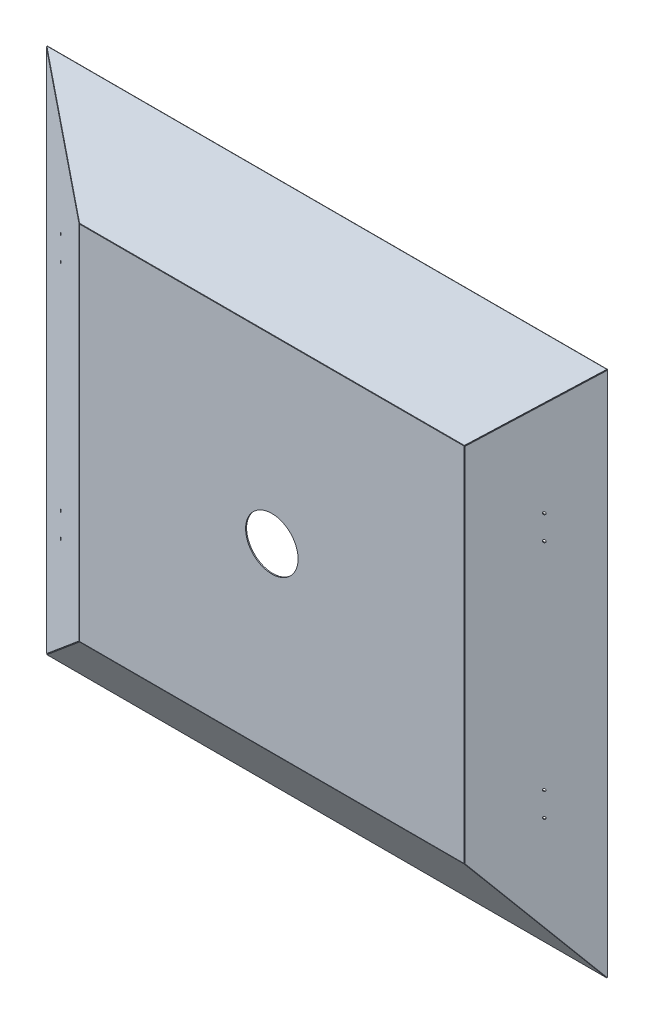
ISO-10303-21;
HEADER;
FILE_DESCRIPTION(('STEP AP214'),'2;1');
FILE_NAME('part.step','',(''),(''),'','','');
FILE_SCHEMA(('AUTOMOTIVE_DESIGN { 1 0 10303 214 1 1 1 1 }'));
ENDSEC;
DATA;
#1=APPLICATION_CONTEXT('core data for automotive mechanical design processes');
#2=APPLICATION_PROTOCOL_DEFINITION('international standard','automotive_design',2000,#1);
#3=PRODUCT_CONTEXT('',#1,'mechanical');
#4=PRODUCT('Part','Part','',(#3));
#5=PRODUCT_RELATED_PRODUCT_CATEGORY('part','',(#4));
#6=PRODUCT_DEFINITION_FORMATION('','',#4);
#7=PRODUCT_DEFINITION_CONTEXT('part definition',#1,'design');
#8=PRODUCT_DEFINITION('design','',#6,#7);
#9=PRODUCT_DEFINITION_SHAPE('','',#8);
#10=(LENGTH_UNIT() NAMED_UNIT(*) SI_UNIT(.MILLI.,.METRE.));
#11=(NAMED_UNIT(*) PLANE_ANGLE_UNIT() SI_UNIT($,.RADIAN.));
#12=(NAMED_UNIT(*) SI_UNIT($,.STERADIAN.) SOLID_ANGLE_UNIT());
#13=UNCERTAINTY_MEASURE_WITH_UNIT(LENGTH_MEASURE(1.E-05),#10,'distance_accuracy_value','');
#14=(GEOMETRIC_REPRESENTATION_CONTEXT(3) GLOBAL_UNCERTAINTY_ASSIGNED_CONTEXT((#13)) GLOBAL_UNIT_ASSIGNED_CONTEXT((#10,
#11,#12)) REPRESENTATION_CONTEXT('',''));
#15=CARTESIAN_POINT('',(0.,0.,0.));
#16=DIRECTION('',(0.,0.,1.));
#17=DIRECTION('',(1.,0.,0.));
#18=AXIS2_PLACEMENT_3D('',#15,#16,#17);
#19=CARTESIAN_POINT('',(-564.294117647059,-530.000000000001,103.));
#20=DIRECTION('',(1.,0.,0.));
#21=DIRECTION('',(0.,0.,-1.));
#22=AXIS2_PLACEMENT_3D('',#19,#20,#21);
#23=PLANE('',#22);
#24=DIRECTION('',(0.,-1.,0.));
#25=VECTOR('',#24,1.);
#26=CARTESIAN_POINT('',(-564.294117647059,-530.000000000001,100.));
#27=LINE('',#26,#25);
#28=CARTESIAN_POINT('',(-564.294117647059,530.000000000001,100.));
#29=VERTEX_POINT('',#28);
#30=CARTESIAN_POINT('',(-564.294117647059,-530.000000000001,100.));
#31=VERTEX_POINT('',#30);
#32=EDGE_CURVE('E120',#29,#31,#27,.T.);
#33=ORIENTED_EDGE('',*,*,#32,.T.);
#34=DIRECTION('',(0.,0.,-1.));
#35=VECTOR('',#34,1.);
#36=CARTESIAN_POINT('',(-564.294117647059,-530.000000000001,103.));
#37=LINE('',#36,#35);
#38=CARTESIAN_POINT('',(-564.294117647059,-530.000000000001,103.));
#39=VERTEX_POINT('',#38);
#40=EDGE_CURVE('E12',#39,#31,#37,.T.);
#41=ORIENTED_EDGE('',*,*,#40,.F.);
#42=DIRECTION('',(0.,-1.,0.));
#43=VECTOR('',#42,1.);
#44=CARTESIAN_POINT('',(-564.294117647059,-530.000000000001,103.));
#45=LINE('',#44,#43);
#46=CARTESIAN_POINT('',(-564.294117647059,530.000000000001,103.));
#47=VERTEX_POINT('',#46);
#48=EDGE_CURVE('E102',#47,#39,#45,.T.);
#49=ORIENTED_EDGE('',*,*,#48,.F.);
#50=DIRECTION('',(0.,0.,-1.));
#51=VECTOR('',#50,1.);
#52=CARTESIAN_POINT('',(-564.294117647059,530.000000000001,103.));
#53=LINE('',#52,#51);
#54=EDGE_CURVE('E116',#47,#29,#53,.T.);
#55=ORIENTED_EDGE('',*,*,#54,.T.);
#56=EDGE_LOOP('',(#33,#41,#49,#55));
#57=FACE_BOUND('',#56,.T.);
#58=ADVANCED_FACE('F49',(#57),#23,.F.);
#59=CARTESIAN_POINT('',(-564.294117647059,-530.000000000001,103.));
#60=DIRECTION('',(0.,1.,0.));
#61=DIRECTION('',(0.,0.,1.));
#62=AXIS2_PLACEMENT_3D('',#59,#60,#61);
#63=PLANE('',#62);
#64=DIRECTION('',(1.,0.,0.));
#65=VECTOR('',#64,1.);
#66=CARTESIAN_POINT('',(-564.294117647059,-530.000000000001,100.));
#67=LINE('',#66,#65);
#68=CARTESIAN_POINT('',(564.294117647059,-530.000000000001,100.));
#69=VERTEX_POINT('',#68);
#70=EDGE_CURVE('E107',#31,#69,#67,.T.);
#71=ORIENTED_EDGE('',*,*,#70,.T.);
#72=DIRECTION('',(0.,0.,-1.));
#73=VECTOR('',#72,1.);
#74=CARTESIAN_POINT('',(564.294117647059,-530.000000000001,103.));
#75=LINE('',#74,#73);
#76=CARTESIAN_POINT('',(564.294117647059,-530.000000000001,103.));
#77=VERTEX_POINT('',#76);
#78=EDGE_CURVE('E59',#77,#69,#75,.T.);
#79=ORIENTED_EDGE('',*,*,#78,.F.);
#80=DIRECTION('',(1.,0.,0.));
#81=VECTOR('',#80,1.);
#82=CARTESIAN_POINT('',(-564.294117647059,-530.000000000001,103.));
#83=LINE('',#82,#81);
#84=EDGE_CURVE('E97',#39,#77,#83,.T.);
#85=ORIENTED_EDGE('',*,*,#84,.F.);
#86=ORIENTED_EDGE('',*,*,#40,.T.);
#87=EDGE_LOOP('',(#71,#79,#85,#86));
#88=FACE_BOUND('',#87,.T.);
#89=ADVANCED_FACE('F106',(#88),#63,.F.);
#90=CARTESIAN_POINT('',(564.294117647059,-530.000000000001,103.));
#91=DIRECTION('',(-1.,0.,0.));
#92=DIRECTION('',(0.,0.,1.));
#93=AXIS2_PLACEMENT_3D('',#90,#91,#92);
#94=PLANE('',#93);
#95=DIRECTION('',(0.,1.,0.));
#96=VECTOR('',#95,1.);
#97=CARTESIAN_POINT('',(564.294117647059,-530.000000000001,100.));
#98=LINE('',#97,#96);
#99=CARTESIAN_POINT('',(564.294117647059,530.000000000001,100.));
#100=VERTEX_POINT('',#99);
#101=EDGE_CURVE('E84',#69,#100,#98,.T.);
#102=ORIENTED_EDGE('',*,*,#101,.T.);
#103=DIRECTION('',(0.,0.,-1.));
#104=VECTOR('',#103,1.);
#105=CARTESIAN_POINT('',(564.294117647059,530.000000000001,103.));
#106=LINE('',#105,#104);
#107=CARTESIAN_POINT('',(564.294117647059,530.000000000001,103.));
#108=VERTEX_POINT('',#107);
#109=EDGE_CURVE('E109',#108,#100,#106,.T.);
#110=ORIENTED_EDGE('',*,*,#109,.F.);
#111=DIRECTION('',(0.,1.,0.));
#112=VECTOR('',#111,1.);
#113=CARTESIAN_POINT('',(564.294117647059,-530.000000000001,103.));
#114=LINE('',#113,#112);
#115=EDGE_CURVE('E100',#77,#108,#114,.T.);
#116=ORIENTED_EDGE('',*,*,#115,.F.);
#117=ORIENTED_EDGE('',*,*,#78,.T.);
#118=EDGE_LOOP('',(#102,#110,#116,#117));
#119=FACE_BOUND('',#118,.T.);
#120=ADVANCED_FACE('F111',(#119),#94,.F.);
#121=CARTESIAN_POINT('',(-564.294117647059,530.000000000001,103.));
#122=DIRECTION('',(0.,-1.,0.));
#123=DIRECTION('',(0.,0.,-1.));
#124=AXIS2_PLACEMENT_3D('',#121,#122,#123);
#125=PLANE('',#124);
#126=DIRECTION('',(-1.,0.,0.));
#127=VECTOR('',#126,1.);
#128=CARTESIAN_POINT('',(-564.294117647059,530.000000000001,100.));
#129=LINE('',#128,#127);
#130=EDGE_CURVE('E90',#100,#29,#129,.T.);
#131=ORIENTED_EDGE('',*,*,#130,.T.);
#132=ORIENTED_EDGE('',*,*,#54,.F.);
#133=DIRECTION('',(-1.,0.,0.));
#134=VECTOR('',#133,1.);
#135=CARTESIAN_POINT('',(-564.294117647059,530.000000000001,103.));
#136=LINE('',#135,#134);
#137=EDGE_CURVE('E67',#108,#47,#136,.T.);
#138=ORIENTED_EDGE('',*,*,#137,.F.);
#139=ORIENTED_EDGE('',*,*,#109,.T.);
#140=EDGE_LOOP('',(#131,#132,#138,#139));
#141=FACE_BOUND('',#140,.T.);
#142=ADVANCED_FACE('F134',(#141),#125,.F.);
#143=CARTESIAN_POINT('',(0.,0.,103.));
#144=DIRECTION('',(0.,0.,-1.));
#145=DIRECTION('',(-1.,0.,0.));
#146=AXIS2_PLACEMENT_3D('',#143,#144,#145);
#147=PLANE('',#146);
#148=CARTESIAN_POINT('',(0.,0.,103.));
#149=DIRECTION('',(0.,0.,1.));
#150=DIRECTION('',(1.,0.,0.));
#151=AXIS2_PLACEMENT_3D('',#148,#149,#150);
#152=CIRCLE('',#151,77.);
#153=CARTESIAN_POINT('',(77.,0.,103.));
#154=VERTEX_POINT('',#153);
#155=EDGE_CURVE('E141',#154,#154,#152,.T.);
#156=ORIENTED_EDGE('',*,*,#155,.F.);
#157=EDGE_LOOP('',(#156));
#158=FACE_BOUND('',#157,.T.);
#159=ORIENTED_EDGE('',*,*,#48,.T.);
#160=ORIENTED_EDGE('',*,*,#84,.T.);
#161=ORIENTED_EDGE('',*,*,#115,.T.);
#162=ORIENTED_EDGE('',*,*,#137,.T.);
#163=EDGE_LOOP('',(#159,#160,#161,#162));
#164=FACE_BOUND('',#163,.T.);
#165=ADVANCED_FACE('F98',(#158,#164),#147,.F.);
#166=CARTESIAN_POINT('',(0.,0.,100.));
#167=DIRECTION('',(0.,0.,-1.));
#168=DIRECTION('',(-1.,0.,0.));
#169=AXIS2_PLACEMENT_3D('',#166,#167,#168);
#170=PLANE('',#169);
#171=CARTESIAN_POINT('',(0.,0.,100.));
#172=DIRECTION('',(0.,0.,-1.));
#173=DIRECTION('',(-1.,0.,0.));
#174=AXIS2_PLACEMENT_3D('',#171,#172,#173);
#175=CIRCLE('',#174,77.);
#176=CARTESIAN_POINT('',(-77.,0.,100.));
#177=VERTEX_POINT('',#176);
#178=EDGE_CURVE('E52',#177,#177,#175,.T.);
#179=ORIENTED_EDGE('',*,*,#178,.F.);
#180=EDGE_LOOP('',(#179));
#181=FACE_BOUND('',#180,.T.);
#182=ORIENTED_EDGE('',*,*,#32,.F.);
#183=ORIENTED_EDGE('',*,*,#130,.F.);
#184=ORIENTED_EDGE('',*,*,#101,.F.);
#185=ORIENTED_EDGE('',*,*,#70,.F.);
#186=EDGE_LOOP('',(#182,#183,#184,#185));
#187=FACE_BOUND('',#186,.T.);
#188=ADVANCED_FACE('F137',(#181,#187),#170,.T.);
#189=CARTESIAN_POINT('',(0.,0.,-60.8630569053165));
#190=DIRECTION('',(0.,0.,1.));
#191=DIRECTION('',(1.,0.,0.));
#192=AXIS2_PLACEMENT_3D('',#189,#190,#191);
#193=CYLINDRICAL_SURFACE('',#192,77.);
#194=ORIENTED_EDGE('',*,*,#178,.T.);
#195=EDGE_LOOP('',(#194));
#196=FACE_BOUND('',#195,.T.);
#197=ORIENTED_EDGE('',*,*,#155,.T.);
#198=EDGE_LOOP('',(#197));
#199=FACE_BOUND('',#198,.T.);
#200=ADVANCED_FACE('F148',(#196,#199),#193,.F.);
#201=CLOSED_SHELL('',(#58,#89,#120,#142,#165,#188,#200));
#202=MANIFOLD_SOLID_BREP('B2',#201);
#203=CARTESIAN_POINT('',(821.201882057608,772.958685946651,-58.3669060223028));
#204=DIRECTION('',(0.748523324739464,-0.551739590950491,0.367826393966994));
#205=DIRECTION('',(0.593335698649479,0.804955122170258,0.));
#206=AXIS2_PLACEMENT_3D('',#203,#204,#205);
#207=PLANE('',#206);
#208=DIRECTION('',(-0.663108461958508,-0.622809052668213,0.415206035112142));
#209=VECTOR('',#208,1.);
#210=CARTESIAN_POINT('',(821.201882057608,771.294585357975,-60.8630569053163));
#211=LINE('',#210,#209);
#212=CARTESIAN_POINT('',(821.201882057608,771.294585357975,-60.8630569053163));
#213=VERTEX_POINT('',#212);
#214=CARTESIAN_POINT('',(564.294117647059,530.000000000001,100.));
#215=VERTEX_POINT('',#214);
#216=EDGE_CURVE('E294',#213,#215,#211,.T.);
#217=ORIENTED_EDGE('',*,*,#216,.F.);
#218=DIRECTION('',(0.,-0.554700196225229,-0.832050294337844));
#219=VECTOR('',#218,1.);
#220=CARTESIAN_POINT('',(821.201882057608,772.958685946651,-58.3669060223028));
#221=LINE('',#220,#219);
#222=CARTESIAN_POINT('',(821.201882057608,772.958685946651,-58.3669060223028));
#223=VERTEX_POINT('',#222);
#224=EDGE_CURVE('E47',#223,#213,#221,.T.);
#225=ORIENTED_EDGE('',*,*,#224,.F.);
#226=DIRECTION('',(-0.663108461958508,-0.622809052668213,0.415206035112142));
#227=VECTOR('',#226,1.);
#228=CARTESIAN_POINT('',(821.201882057608,772.958685946651,-58.3669060223028));
#229=LINE('',#228,#227);
#230=CARTESIAN_POINT('',(564.294117647059,531.664100588677,102.496150883014));
#231=VERTEX_POINT('',#230);
#232=EDGE_CURVE('E286',#223,#231,#229,.T.);
#233=ORIENTED_EDGE('',*,*,#232,.T.);
#234=DIRECTION('',(0.,-0.554700196225229,-0.832050294337844));
#235=VECTOR('',#234,1.);
#236=CARTESIAN_POINT('',(564.294117647059,531.664100588677,102.496150883014));
#237=LINE('',#236,#235);
#238=EDGE_CURVE('E227',#231,#215,#237,.T.);
#239=ORIENTED_EDGE('',*,*,#238,.T.);
#240=EDGE_LOOP('',(#217,#225,#233,#239));
#241=FACE_BOUND('',#240,.T.);
#242=ADVANCED_FACE('F224',(#241),#207,.T.);
#243=CARTESIAN_POINT('',(-821.201882057608,772.958685946651,-58.3669060223029));
#244=DIRECTION('',(0.,0.832050294337844,-0.554700196225229));
#245=DIRECTION('',(0.,0.554700196225229,0.832050294337844));
#246=AXIS2_PLACEMENT_3D('',#243,#244,#245);
#247=PLANE('',#246);
#248=DIRECTION('',(1.,0.,0.));
#249=VECTOR('',#248,1.);
#250=CARTESIAN_POINT('',(-821.201882057608,771.294585357976,-60.8630569053164));
#251=LINE('',#250,#249);
#252=CARTESIAN_POINT('',(-821.201882057608,771.294585357976,-60.8630569053164));
#253=VERTEX_POINT('',#252);
#254=EDGE_CURVE('E289',#253,#213,#251,.T.);
#255=ORIENTED_EDGE('',*,*,#254,.F.);
#256=DIRECTION('',(0.,-0.554700196225229,-0.832050294337844));
#257=VECTOR('',#256,1.);
#258=CARTESIAN_POINT('',(-821.201882057608,772.958685946651,-58.3669060223029));
#259=LINE('',#258,#257);
#260=CARTESIAN_POINT('',(-821.201882057608,772.958685946651,-58.3669060223029));
#261=VERTEX_POINT('',#260);
#262=EDGE_CURVE('E234',#261,#253,#259,.T.);
#263=ORIENTED_EDGE('',*,*,#262,.F.);
#264=DIRECTION('',(1.,0.,0.));
#265=VECTOR('',#264,1.);
#266=CARTESIAN_POINT('',(-821.201882057608,772.958685946651,-58.3669060223029));
#267=LINE('',#266,#265);
#268=EDGE_CURVE('E281',#261,#223,#267,.T.);
#269=ORIENTED_EDGE('',*,*,#268,.T.);
#270=ORIENTED_EDGE('',*,*,#224,.T.);
#271=EDGE_LOOP('',(#255,#263,#269,#270));
#272=FACE_BOUND('',#271,.T.);
#273=ADVANCED_FACE('F310',(#272),#247,.T.);
#274=CARTESIAN_POINT('',(-564.294117647059,531.664100588677,102.496150883014));
#275=DIRECTION('',(-0.748523324739465,-0.551739590950491,0.367826393966994));
#276=DIRECTION('',(0.593335698649479,-0.804955122170258,0.));
#277=AXIS2_PLACEMENT_3D('',#274,#275,#276);
#278=PLANE('',#277);
#279=DIRECTION('',(-0.663108461958508,0.622809052668213,-0.415206035112142));
#280=VECTOR('',#279,1.);
#281=CARTESIAN_POINT('',(-564.294117647059,530.000000000001,100.));
#282=LINE('',#281,#280);
#283=CARTESIAN_POINT('',(-564.294117647059,530.000000000001,100.));
#284=VERTEX_POINT('',#283);
#285=EDGE_CURVE('E275',#284,#253,#282,.T.);
#286=ORIENTED_EDGE('',*,*,#285,.F.);
#287=DIRECTION('',(0.,-0.554700196225229,-0.832050294337844));
#288=VECTOR('',#287,1.);
#289=CARTESIAN_POINT('',(-564.294117647059,531.664100588677,102.496150883014));
#290=LINE('',#289,#288);
#291=CARTESIAN_POINT('',(-564.294117647059,531.664100588677,102.496150883014));
#292=VERTEX_POINT('',#291);
#293=EDGE_CURVE('E270',#292,#284,#290,.T.);
#294=ORIENTED_EDGE('',*,*,#293,.F.);
#295=DIRECTION('',(-0.663108461958508,0.622809052668213,-0.415206035112142));
#296=VECTOR('',#295,1.);
#297=CARTESIAN_POINT('',(-564.294117647059,531.664100588677,102.496150883014));
#298=LINE('',#297,#296);
#299=EDGE_CURVE('E273',#292,#261,#298,.T.);
#300=ORIENTED_EDGE('',*,*,#299,.T.);
#301=ORIENTED_EDGE('',*,*,#262,.T.);
#302=EDGE_LOOP('',(#286,#294,#300,#301));
#303=FACE_BOUND('',#302,.T.);
#304=ADVANCED_FACE('F272',(#303),#278,.T.);
#305=CARTESIAN_POINT('',(564.294117647059,531.664100588677,102.496150883014));
#306=DIRECTION('',(0.,-0.832050294337844,0.554700196225229));
#307=DIRECTION('',(0.,-0.554700196225229,-0.832050294337844));
#308=AXIS2_PLACEMENT_3D('',#305,#306,#307);
#309=PLANE('',#308);
#310=DIRECTION('',(-1.,0.,0.));
#311=VECTOR('',#310,1.);
#312=CARTESIAN_POINT('',(564.294117647059,530.000000000001,100.));
#313=LINE('',#312,#311);
#314=EDGE_CURVE('E298',#215,#284,#313,.T.);
#315=ORIENTED_EDGE('',*,*,#314,.F.);
#316=ORIENTED_EDGE('',*,*,#238,.F.);
#317=DIRECTION('',(-1.,0.,0.));
#318=VECTOR('',#317,1.);
#319=CARTESIAN_POINT('',(564.294117647059,531.664100588677,102.496150883014));
#320=LINE('',#319,#318);
#321=EDGE_CURVE('E280',#231,#292,#320,.T.);
#322=ORIENTED_EDGE('',*,*,#321,.T.);
#323=ORIENTED_EDGE('',*,*,#293,.T.);
#324=EDGE_LOOP('',(#315,#316,#322,#323));
#325=FACE_BOUND('',#324,.T.);
#326=ADVANCED_FACE('F284',(#325),#309,.T.);
#327=CARTESIAN_POINT('',(0.,210.894869819445,316.342304729168));
#328=DIRECTION('',(0.,-0.554700196225229,-0.832050294337844));
#329=DIRECTION('',(0.,0.832050294337844,-0.554700196225229));
#330=AXIS2_PLACEMENT_3D('',#327,#328,#329);
#331=PLANE('',#330);
#332=ORIENTED_EDGE('',*,*,#232,.F.);
#333=ORIENTED_EDGE('',*,*,#268,.F.);
#334=ORIENTED_EDGE('',*,*,#299,.F.);
#335=ORIENTED_EDGE('',*,*,#321,.F.);
#336=EDGE_LOOP('',(#332,#333,#334,#335));
#337=FACE_BOUND('',#336,.T.);
#338=ADVANCED_FACE('F279',(#337),#331,.F.);
#339=CARTESIAN_POINT('',(0.,209.23076923077,313.846153846154));
#340=DIRECTION('',(0.,-0.554700196225229,-0.832050294337844));
#341=DIRECTION('',(0.,0.832050294337844,-0.554700196225229));
#342=AXIS2_PLACEMENT_3D('',#339,#340,#341);
#343=PLANE('',#342);
#344=ORIENTED_EDGE('',*,*,#216,.T.);
#345=ORIENTED_EDGE('',*,*,#314,.T.);
#346=ORIENTED_EDGE('',*,*,#285,.T.);
#347=ORIENTED_EDGE('',*,*,#254,.T.);
#348=EDGE_LOOP('',(#344,#345,#346,#347));
#349=FACE_BOUND('',#348,.T.);
#350=ADVANCED_FACE('F309',(#349),#343,.T.);
#351=CLOSED_SHELL('',(#242,#273,#304,#326,#338,#350));
#352=MANIFOLD_SOLID_BREP('B6',#351);
#353=CARTESIAN_POINT('',(822.793982895128,771.294585357976,-58.3203782148071));
#354=DIRECTION('',(-0.847559563503061,0.,0.530700279173188));
#355=DIRECTION('',(0.530700279173188,0.,0.847559563503061));
#356=AXIS2_PLACEMENT_3D('',#353,#354,#355);
#357=PLANE('',#356);
#358=DIRECTION('',(0.,1.,0.));
#359=VECTOR('',#358,1.);
#360=CARTESIAN_POINT('',(821.201882057608,771.294585357976,-60.8630569053162));
#361=LINE('',#360,#359);
#362=CARTESIAN_POINT('',(821.201882057608,-771.294585357976,-60.8630569053162));
#363=VERTEX_POINT('',#362);
#364=CARTESIAN_POINT('',(821.201882057608,771.294585357976,-60.8630569053162));
#365=VERTEX_POINT('',#364);
#366=EDGE_CURVE('E444',#363,#365,#361,.T.);
#367=ORIENTED_EDGE('',*,*,#366,.T.);
#368=DIRECTION('',(-0.530700279173188,0.,-0.847559563503061));
#369=VECTOR('',#368,1.);
#370=CARTESIAN_POINT('',(822.793982895128,771.294585357976,-58.3203782148071));
#371=LINE('',#370,#369);
#372=CARTESIAN_POINT('',(822.793982895128,771.294585357976,-58.3203782148071));
#373=VERTEX_POINT('',#372);
#374=EDGE_CURVE('E222',#373,#365,#371,.T.);
#375=ORIENTED_EDGE('',*,*,#374,.F.);
#376=DIRECTION('',(0.,1.,0.));
#377=VECTOR('',#376,1.);
#378=CARTESIAN_POINT('',(822.793982895128,771.294585357976,-58.3203782148071));
#379=LINE('',#378,#377);
#380=CARTESIAN_POINT('',(822.793982895127,-771.294585357976,-58.320378214807));
#381=VERTEX_POINT('',#380);
#382=EDGE_CURVE('E427',#381,#373,#379,.T.);
#383=ORIENTED_EDGE('',*,*,#382,.F.);
#384=DIRECTION('',(-0.530700279173188,0.,-0.847559563503061));
#385=VECTOR('',#384,1.);
#386=CARTESIAN_POINT('',(822.793982895127,-771.294585357976,-58.320378214807));
#387=LINE('',#386,#385);
#388=EDGE_CURVE('E440',#381,#363,#387,.T.);
#389=ORIENTED_EDGE('',*,*,#388,.T.);
#390=EDGE_LOOP('',(#367,#375,#383,#389));
#391=FACE_BOUND('',#390,.T.);
#392=ADVANCED_FACE('F375',(#391),#357,.F.);
#393=CARTESIAN_POINT('',(565.886218484578,530.000000000001,102.542678690509));
#394=DIRECTION('',(0.527867768825226,-0.782373877321146,-0.330524938122609));
#395=DIRECTION('',(0.82896392230345,0.55930207895133,0.));
#396=AXIS2_PLACEMENT_3D('',#393,#394,#395);
#397=PLANE('',#396);
#398=DIRECTION('',(-0.663108461958508,-0.622809052668213,0.415206035112142));
#399=VECTOR('',#398,1.);
#400=CARTESIAN_POINT('',(564.294117647059,530.000000000001,100.));
#401=LINE('',#400,#399);
#402=CARTESIAN_POINT('',(564.294117647059,530.000000000001,100.));
#403=VERTEX_POINT('',#402);
#404=EDGE_CURVE('E432',#365,#403,#401,.T.);
#405=ORIENTED_EDGE('',*,*,#404,.T.);
#406=DIRECTION('',(-0.530700279173188,0.,-0.847559563503061));
#407=VECTOR('',#406,1.);
#408=CARTESIAN_POINT('',(565.886218484578,530.000000000001,102.542678690509));
#409=LINE('',#408,#407);
#410=CARTESIAN_POINT('',(565.886218484578,530.000000000001,102.542678690509));
#411=VERTEX_POINT('',#410);
#412=EDGE_CURVE('E384',#411,#403,#409,.T.);
#413=ORIENTED_EDGE('',*,*,#412,.F.);
#414=DIRECTION('',(-0.663108461958508,-0.622809052668213,0.415206035112142));
#415=VECTOR('',#414,1.);
#416=CARTESIAN_POINT('',(565.886218484578,530.000000000001,102.542678690509));
#417=LINE('',#416,#415);
#418=EDGE_CURVE('E422',#373,#411,#417,.T.);
#419=ORIENTED_EDGE('',*,*,#418,.F.);
#420=ORIENTED_EDGE('',*,*,#374,.T.);
#421=EDGE_LOOP('',(#405,#413,#419,#420));
#422=FACE_BOUND('',#421,.T.);
#423=ADVANCED_FACE('F431',(#422),#397,.F.);
#424=CARTESIAN_POINT('',(565.886218484578,-530.000000000001,102.542678690509));
#425=DIRECTION('',(0.847559563503061,0.,-0.530700279173188));
#426=DIRECTION('',(-0.530700279173188,0.,-0.847559563503061));
#427=AXIS2_PLACEMENT_3D('',#424,#425,#426);
#428=PLANE('',#427);
#429=DIRECTION('',(0.,-1.,0.));
#430=VECTOR('',#429,1.);
#431=CARTESIAN_POINT('',(564.294117647059,-530.000000000001,100.));
#432=LINE('',#431,#430);
#433=CARTESIAN_POINT('',(564.294117647059,-530.000000000001,100.));
#434=VERTEX_POINT('',#433);
#435=EDGE_CURVE('E409',#403,#434,#432,.T.);
#436=ORIENTED_EDGE('',*,*,#435,.T.);
#437=DIRECTION('',(-0.530700279173188,0.,-0.847559563503061));
#438=VECTOR('',#437,1.);
#439=CARTESIAN_POINT('',(565.886218484578,-530.000000000001,102.542678690509));
#440=LINE('',#439,#438);
#441=CARTESIAN_POINT('',(565.886218484578,-530.000000000001,102.542678690509));
#442=VERTEX_POINT('',#441);
#443=EDGE_CURVE('E434',#442,#434,#440,.T.);
#444=ORIENTED_EDGE('',*,*,#443,.F.);
#445=DIRECTION('',(0.,-1.,0.));
#446=VECTOR('',#445,1.);
#447=CARTESIAN_POINT('',(565.886218484578,-530.000000000001,102.542678690509));
#448=LINE('',#447,#446);
#449=EDGE_CURVE('E425',#411,#442,#448,.T.);
#450=ORIENTED_EDGE('',*,*,#449,.F.);
#451=ORIENTED_EDGE('',*,*,#412,.T.);
#452=EDGE_LOOP('',(#436,#444,#450,#451));
#453=FACE_BOUND('',#452,.T.);
#454=ADVANCED_FACE('F435',(#453),#428,.F.);
#455=CARTESIAN_POINT('',(822.793982895127,-771.294585357976,-58.320378214807));
#456=DIRECTION('',(0.527867768825226,0.782373877321145,-0.33052493812261));
#457=DIRECTION('',(-0.82896392230345,0.559302078951331,0.));
#458=AXIS2_PLACEMENT_3D('',#455,#456,#457);
#459=PLANE('',#458);
#460=DIRECTION('',(0.663108461958508,-0.622809052668213,-0.415206035112142));
#461=VECTOR('',#460,1.);
#462=CARTESIAN_POINT('',(821.201882057608,-771.294585357976,-60.8630569053162));
#463=LINE('',#462,#461);
#464=EDGE_CURVE('E415',#434,#363,#463,.T.);
#465=ORIENTED_EDGE('',*,*,#464,.T.);
#466=ORIENTED_EDGE('',*,*,#388,.F.);
#467=DIRECTION('',(0.663108461958508,-0.622809052668213,-0.415206035112142));
#468=VECTOR('',#467,1.);
#469=CARTESIAN_POINT('',(822.793982895127,-771.294585357976,-58.320378214807));
#470=LINE('',#469,#468);
#471=EDGE_CURVE('E392',#442,#381,#470,.T.);
#472=ORIENTED_EDGE('',*,*,#471,.F.);
#473=ORIENTED_EDGE('',*,*,#443,.T.);
#474=EDGE_LOOP('',(#465,#466,#472,#473));
#475=FACE_BOUND('',#474,.T.);
#476=ADVANCED_FACE('F459',(#475),#459,.F.);
#477=CARTESIAN_POINT('',(205.501478129218,0.,328.197948894603));
#478=DIRECTION('',(-0.530700279173188,0.,-0.847559563503061));
#479=DIRECTION('',(-0.847559563503061,0.,0.530700279173188));
#480=AXIS2_PLACEMENT_3D('',#477,#478,#479);
#481=PLANE('',#480);
#482=CARTESIAN_POINT('',(708.949551814626,387.,12.9634276182877));
#483=DIRECTION('',(-0.530700279173188,0.,-0.847559563503061));
#484=DIRECTION('',(-0.847559563503061,0.,0.530700279173188));
#485=AXIS2_PLACEMENT_3D('',#482,#483,#484);
#486=CIRCLE('',#485,4.00000000000001);
#487=CARTESIAN_POINT('',(705.559313560614,387.,15.0862287349804));
#488=VERTEX_POINT('',#487);
#489=EDGE_CURVE('E448',#488,#488,#486,.T.);
#490=ORIENTED_EDGE('',*,*,#489,.T.);
#491=EDGE_LOOP('',(#490));
#492=FACE_BOUND('',#491,.T.);
#493=CARTESIAN_POINT('',(708.949551814626,316.,12.9634276182877));
#494=DIRECTION('',(-0.530700279173188,0.,-0.847559563503061));
#495=DIRECTION('',(-0.847559563503061,0.,0.530700279173188));
#496=AXIS2_PLACEMENT_3D('',#493,#494,#495);
#497=CIRCLE('',#496,4.00000000000001);
#498=CARTESIAN_POINT('',(705.559313560614,316.,15.0862287349804));
#499=VERTEX_POINT('',#498);
#500=EDGE_CURVE('E470',#499,#499,#497,.T.);
#501=ORIENTED_EDGE('',*,*,#500,.T.);
#502=EDGE_LOOP('',(#501));
#503=FACE_BOUND('',#502,.T.);
#504=CARTESIAN_POINT('',(708.949551814626,-316.,12.9634276182877));
#505=DIRECTION('',(-0.530700279173188,0.,-0.847559563503061));
#506=DIRECTION('',(-0.847559563503061,0.,0.530700279173188));
#507=AXIS2_PLACEMENT_3D('',#504,#505,#506);
#508=CIRCLE('',#507,4.00000000000001);
#509=CARTESIAN_POINT('',(705.559313560614,-316.,15.0862287349804));
#510=VERTEX_POINT('',#509);
#511=EDGE_CURVE('E473',#510,#510,#508,.T.);
#512=ORIENTED_EDGE('',*,*,#511,.T.);
#513=EDGE_LOOP('',(#512));
#514=FACE_BOUND('',#513,.T.);
#515=CARTESIAN_POINT('',(708.949551814626,-387.,12.9634276182877));
#516=DIRECTION('',(-0.530700279173188,0.,-0.847559563503061));
#517=DIRECTION('',(-0.847559563503061,0.,0.530700279173188));
#518=AXIS2_PLACEMENT_3D('',#515,#516,#517);
#519=CIRCLE('',#518,4.00000000000001);
#520=CARTESIAN_POINT('',(705.559313560614,-387.,15.0862287349804));
#521=VERTEX_POINT('',#520);
#522=EDGE_CURVE('E477',#521,#521,#519,.T.);
#523=ORIENTED_EDGE('',*,*,#522,.T.);
#524=EDGE_LOOP('',(#523));
#525=FACE_BOUND('',#524,.T.);
#526=ORIENTED_EDGE('',*,*,#382,.T.);
#527=ORIENTED_EDGE('',*,*,#418,.T.);
#528=ORIENTED_EDGE('',*,*,#449,.T.);
#529=ORIENTED_EDGE('',*,*,#471,.T.);
#530=EDGE_LOOP('',(#526,#527,#528,#529));
#531=FACE_BOUND('',#530,.T.);
#532=ADVANCED_FACE('F423',(#492,#503,#514,#525,#531),#481,.F.);
#533=CARTESIAN_POINT('',(203.909377291698,0.,325.655270204094));
#534=DIRECTION('',(-0.530700279173188,0.,-0.847559563503061));
#535=DIRECTION('',(-0.847559563503061,0.,0.530700279173188));
#536=AXIS2_PLACEMENT_3D('',#533,#534,#535);
#537=PLANE('',#536);
#538=CARTESIAN_POINT('',(707.357450977107,387.,10.4207489277786));
#539=DIRECTION('',(-0.530700279173188,0.,-0.847559563503061));
#540=DIRECTION('',(-0.847559563503061,0.,0.530700279173188));
#541=AXIS2_PLACEMENT_3D('',#538,#539,#540);
#542=CIRCLE('',#541,4.00000000000001);
#543=CARTESIAN_POINT('',(703.967212723094,387.,12.5435500444713));
#544=VERTEX_POINT('',#543);
#545=EDGE_CURVE('E481',#544,#544,#542,.T.);
#546=ORIENTED_EDGE('',*,*,#545,.F.);
#547=EDGE_LOOP('',(#546));
#548=FACE_BOUND('',#547,.T.);
#549=CARTESIAN_POINT('',(707.357450977107,316.,10.4207489277786));
#550=DIRECTION('',(-0.530700279173188,0.,-0.847559563503061));
#551=DIRECTION('',(-0.847559563503061,0.,0.530700279173188));
#552=AXIS2_PLACEMENT_3D('',#549,#550,#551);
#553=CIRCLE('',#552,4.00000000000001);
#554=CARTESIAN_POINT('',(703.967212723094,316.,12.5435500444713));
#555=VERTEX_POINT('',#554);
#556=EDGE_CURVE('E489',#555,#555,#553,.T.);
#557=ORIENTED_EDGE('',*,*,#556,.F.);
#558=EDGE_LOOP('',(#557));
#559=FACE_BOUND('',#558,.T.);
#560=CARTESIAN_POINT('',(707.357450977107,-316.,10.4207489277786));
#561=DIRECTION('',(-0.530700279173188,0.,-0.847559563503061));
#562=DIRECTION('',(-0.847559563503061,0.,0.530700279173188));
#563=AXIS2_PLACEMENT_3D('',#560,#561,#562);
#564=CIRCLE('',#563,4.00000000000001);
#565=CARTESIAN_POINT('',(703.967212723094,-316.,12.5435500444713));
#566=VERTEX_POINT('',#565);
#567=EDGE_CURVE('E486',#566,#566,#564,.T.);
#568=ORIENTED_EDGE('',*,*,#567,.F.);
#569=EDGE_LOOP('',(#568));
#570=FACE_BOUND('',#569,.T.);
#571=CARTESIAN_POINT('',(707.357450977107,-387.,10.4207489277786));
#572=DIRECTION('',(-0.530700279173188,0.,-0.847559563503061));
#573=DIRECTION('',(-0.847559563503061,0.,0.530700279173188));
#574=AXIS2_PLACEMENT_3D('',#571,#572,#573);
#575=CIRCLE('',#574,4.00000000000001);
#576=CARTESIAN_POINT('',(703.967212723094,-387.,12.5435500444713));
#577=VERTEX_POINT('',#576);
#578=EDGE_CURVE('E482',#577,#577,#575,.T.);
#579=ORIENTED_EDGE('',*,*,#578,.F.);
#580=EDGE_LOOP('',(#579));
#581=FACE_BOUND('',#580,.T.);
#582=ORIENTED_EDGE('',*,*,#366,.F.);
#583=ORIENTED_EDGE('',*,*,#464,.F.);
#584=ORIENTED_EDGE('',*,*,#435,.F.);
#585=ORIENTED_EDGE('',*,*,#404,.F.);
#586=EDGE_LOOP('',(#582,#583,#584,#585));
#587=FACE_BOUND('',#586,.T.);
#588=ADVANCED_FACE('F462',(#548,#559,#570,#581,#587),#537,.T.);
#589=CARTESIAN_POINT('',(781.511473578396,-387.,128.849085023368));
#590=DIRECTION('',(-0.530700279173188,0.,-0.847559563503061));
#591=DIRECTION('',(-0.847559563503061,0.,0.530700279173188));
#592=AXIS2_PLACEMENT_3D('',#589,#590,#591);
#593=CYLINDRICAL_SURFACE('',#592,4.00000000000001);
#594=ORIENTED_EDGE('',*,*,#578,.T.);
#595=EDGE_LOOP('',(#594));
#596=FACE_BOUND('',#595,.T.);
#597=ORIENTED_EDGE('',*,*,#522,.F.);
#598=EDGE_LOOP('',(#597));
#599=FACE_BOUND('',#598,.T.);
#600=ADVANCED_FACE('F501',(#596,#599),#593,.F.);
#601=CARTESIAN_POINT('',(781.511473578396,-316.,128.849085023368));
#602=DIRECTION('',(-0.530700279173188,0.,-0.847559563503061));
#603=DIRECTION('',(-0.847559563503061,0.,0.530700279173188));
#604=AXIS2_PLACEMENT_3D('',#601,#602,#603);
#605=CYLINDRICAL_SURFACE('',#604,4.00000000000001);
#606=ORIENTED_EDGE('',*,*,#567,.T.);
#607=EDGE_LOOP('',(#606));
#608=FACE_BOUND('',#607,.T.);
#609=ORIENTED_EDGE('',*,*,#511,.F.);
#610=EDGE_LOOP('',(#609));
#611=FACE_BOUND('',#610,.T.);
#612=ADVANCED_FACE('F511',(#608,#611),#605,.F.);
#613=CARTESIAN_POINT('',(781.511473578396,316.,128.849085023368));
#614=DIRECTION('',(-0.530700279173188,0.,-0.847559563503061));
#615=DIRECTION('',(-0.847559563503061,0.,0.530700279173188));
#616=AXIS2_PLACEMENT_3D('',#613,#614,#615);
#617=CYLINDRICAL_SURFACE('',#616,4.00000000000001);
#618=ORIENTED_EDGE('',*,*,#556,.T.);
#619=EDGE_LOOP('',(#618));
#620=FACE_BOUND('',#619,.T.);
#621=ORIENTED_EDGE('',*,*,#500,.F.);
#622=EDGE_LOOP('',(#621));
#623=FACE_BOUND('',#622,.T.);
#624=ADVANCED_FACE('F556',(#620,#623),#617,.F.);
#625=CARTESIAN_POINT('',(781.511473578396,387.,128.849085023368));
#626=DIRECTION('',(-0.530700279173188,0.,-0.847559563503061));
#627=DIRECTION('',(-0.847559563503061,0.,0.530700279173188));
#628=AXIS2_PLACEMENT_3D('',#625,#626,#627);
#629=CYLINDRICAL_SURFACE('',#628,4.00000000000001);
#630=ORIENTED_EDGE('',*,*,#545,.T.);
#631=EDGE_LOOP('',(#630));
#632=FACE_BOUND('',#631,.T.);
#633=ORIENTED_EDGE('',*,*,#489,.F.);
#634=EDGE_LOOP('',(#633));
#635=FACE_BOUND('',#634,.T.);
#636=ADVANCED_FACE('F496',(#632,#635),#629,.F.);
#637=CLOSED_SHELL('',(#392,#423,#454,#476,#532,#588,#600,#612,#624,#636));
#638=MANIFOLD_SOLID_BREP('B41',#637);
#639=CARTESIAN_POINT('',(-565.886218484579,-530.000000000001,102.542678690509));
#640=DIRECTION('',(0.527867768825226,-0.782373877321146,0.33052493812261));
#641=DIRECTION('',(0.82896392230345,0.55930207895133,0.));
#642=AXIS2_PLACEMENT_3D('',#639,#640,#641);
#643=PLANE('',#642);
#644=DIRECTION('',(-0.663108461958507,-0.622809052668213,-0.415206035112142));
#645=VECTOR('',#644,1.);
#646=CARTESIAN_POINT('',(-564.294117647059,-530.000000000001,100.));
#647=LINE('',#646,#645);
#648=CARTESIAN_POINT('',(-564.294117647059,-530.000000000001,100.));
#649=VERTEX_POINT('',#648);
#650=CARTESIAN_POINT('',(-821.201882057608,-771.294585357976,-60.8630569053165));
#651=VERTEX_POINT('',#650);
#652=EDGE_CURVE('E694',#649,#651,#647,.T.);
#653=ORIENTED_EDGE('',*,*,#652,.F.);
#654=DIRECTION('',(0.530700279173189,0.,-0.847559563503061));
#655=VECTOR('',#654,1.);
#656=CARTESIAN_POINT('',(-565.886218484579,-530.000000000001,102.542678690509));
#657=LINE('',#656,#655);
#658=CARTESIAN_POINT('',(-565.886218484579,-530.000000000001,102.542678690509));
#659=VERTEX_POINT('',#658);
#660=EDGE_CURVE('E373',#659,#649,#657,.T.);
#661=ORIENTED_EDGE('',*,*,#660,.F.);
#662=DIRECTION('',(-0.663108461958507,-0.622809052668213,-0.415206035112142));
#663=VECTOR('',#662,1.);
#664=CARTESIAN_POINT('',(-565.886218484579,-530.000000000001,102.542678690509));
#665=LINE('',#664,#663);
#666=CARTESIAN_POINT('',(-822.793982895128,-771.294585357976,-58.3203782148073));
#667=VERTEX_POINT('',#666);
#668=EDGE_CURVE('E683',#659,#667,#665,.T.);
#669=ORIENTED_EDGE('',*,*,#668,.T.);
#670=DIRECTION('',(0.530700279173189,0.,-0.847559563503061));
#671=VECTOR('',#670,1.);
#672=CARTESIAN_POINT('',(-822.793982895128,-771.294585357976,-58.3203782148073));
#673=LINE('',#672,#671);
#674=EDGE_CURVE('E624',#667,#651,#673,.T.);
#675=ORIENTED_EDGE('',*,*,#674,.T.);
#676=EDGE_LOOP('',(#653,#661,#669,#675));
#677=FACE_BOUND('',#676,.T.);
#678=ADVANCED_FACE('F621',(#677),#643,.T.);
#679=CARTESIAN_POINT('',(-565.886218484579,-530.000000000001,102.542678690509));
#680=DIRECTION('',(0.847559563503061,0.,0.530700279173189));
#681=DIRECTION('',(0.530700279173189,0.,-0.847559563503061));
#682=AXIS2_PLACEMENT_3D('',#679,#680,#681);
#683=PLANE('',#682);
#684=DIRECTION('',(0.,-1.,0.));
#685=VECTOR('',#684,1.);
#686=CARTESIAN_POINT('',(-564.294117647059,-530.000000000001,100.));
#687=LINE('',#686,#685);
#688=CARTESIAN_POINT('',(-564.294117647059,530.000000000001,100.));
#689=VERTEX_POINT('',#688);
#690=EDGE_CURVE('E688',#689,#649,#687,.T.);
#691=ORIENTED_EDGE('',*,*,#690,.F.);
#692=DIRECTION('',(0.530700279173189,0.,-0.847559563503061));
#693=VECTOR('',#692,1.);
#694=CARTESIAN_POINT('',(-565.886218484579,530.000000000001,102.542678690509));
#695=LINE('',#694,#693);
#696=CARTESIAN_POINT('',(-565.886218484579,530.000000000001,102.542678690509));
#697=VERTEX_POINT('',#696);
#698=EDGE_CURVE('E631',#697,#689,#695,.T.);
#699=ORIENTED_EDGE('',*,*,#698,.F.);
#700=DIRECTION('',(0.,-1.,0.));
#701=VECTOR('',#700,1.);
#702=CARTESIAN_POINT('',(-565.886218484579,-530.000000000001,102.542678690509));
#703=LINE('',#702,#701);
#704=EDGE_CURVE('E678',#697,#659,#703,.T.);
#705=ORIENTED_EDGE('',*,*,#704,.T.);
#706=ORIENTED_EDGE('',*,*,#660,.T.);
#707=EDGE_LOOP('',(#691,#699,#705,#706));
#708=FACE_BOUND('',#707,.T.);
#709=ADVANCED_FACE('F764',(#708),#683,.T.);
#710=CARTESIAN_POINT('',(-822.793982895128,771.294585357976,-58.3203782148073));
#711=DIRECTION('',(0.527867768825226,0.782373877321146,0.33052493812261));
#712=DIRECTION('',(-0.82896392230345,0.55930207895133,0.));
#713=AXIS2_PLACEMENT_3D('',#710,#711,#712);
#714=PLANE('',#713);
#715=DIRECTION('',(0.663108461958508,-0.622809052668213,0.415206035112142));
#716=VECTOR('',#715,1.);
#717=CARTESIAN_POINT('',(-821.201882057608,771.294585357976,-60.8630569053165));
#718=LINE('',#717,#716);
#719=CARTESIAN_POINT('',(-821.201882057608,771.294585357976,-60.8630569053165));
#720=VERTEX_POINT('',#719);
#721=EDGE_CURVE('E672',#720,#689,#718,.T.);
#722=ORIENTED_EDGE('',*,*,#721,.F.);
#723=DIRECTION('',(0.530700279173189,0.,-0.847559563503061));
#724=VECTOR('',#723,1.);
#725=CARTESIAN_POINT('',(-822.793982895128,771.294585357976,-58.3203782148073));
#726=LINE('',#725,#724);
#727=CARTESIAN_POINT('',(-822.793982895128,771.294585357976,-58.3203782148073));
#728=VERTEX_POINT('',#727);
#729=EDGE_CURVE('E667',#728,#720,#726,.T.);
#730=ORIENTED_EDGE('',*,*,#729,.F.);
#731=DIRECTION('',(0.663108461958508,-0.622809052668213,0.415206035112142));
#732=VECTOR('',#731,1.);
#733=CARTESIAN_POINT('',(-822.793982895128,771.294585357976,-58.3203782148073));
#734=LINE('',#733,#732);
#735=EDGE_CURVE('E670',#728,#697,#734,.T.);
#736=ORIENTED_EDGE('',*,*,#735,.T.);
#737=ORIENTED_EDGE('',*,*,#698,.T.);
#738=EDGE_LOOP('',(#722,#730,#736,#737));
#739=FACE_BOUND('',#738,.T.);
#740=ADVANCED_FACE('F669',(#739),#714,.T.);
#741=CARTESIAN_POINT('',(-822.793982895128,-771.294585357976,-58.3203782148073));
#742=DIRECTION('',(-0.847559563503061,0.,-0.530700279173189));
#743=DIRECTION('',(-0.530700279173189,0.,0.847559563503061));
#744=AXIS2_PLACEMENT_3D('',#741,#742,#743);
#745=PLANE('',#744);
#746=DIRECTION('',(0.,1.,0.));
#747=VECTOR('',#746,1.);
#748=CARTESIAN_POINT('',(-821.201882057608,-771.294585357976,-60.8630569053165));
#749=LINE('',#748,#747);
#750=EDGE_CURVE('E698',#651,#720,#749,.T.);
#751=ORIENTED_EDGE('',*,*,#750,.F.);
#752=ORIENTED_EDGE('',*,*,#674,.F.);
#753=DIRECTION('',(0.,1.,0.));
#754=VECTOR('',#753,1.);
#755=CARTESIAN_POINT('',(-822.793982895128,-771.294585357976,-58.3203782148073));
#756=LINE('',#755,#754);
#757=EDGE_CURVE('E677',#667,#728,#756,.T.);
#758=ORIENTED_EDGE('',*,*,#757,.T.);
#759=ORIENTED_EDGE('',*,*,#729,.T.);
#760=EDGE_LOOP('',(#751,#752,#758,#759));
#761=FACE_BOUND('',#760,.T.);
#762=ADVANCED_FACE('F681',(#761),#745,.T.);
#763=CARTESIAN_POINT('',(-205.501478129218,-1.31487630572431E-13,328.197948894603));
#764=DIRECTION('',(-0.530700279173189,0.,0.847559563503061));
#765=DIRECTION('',(0.847559563503061,0.,0.530700279173189));
#766=AXIS2_PLACEMENT_3D('',#763,#764,#765);
#767=PLANE('',#766);
#768=CARTESIAN_POINT('',(-708.949551814626,-387.,12.9634276182875));
#769=DIRECTION('',(-0.530700279173189,0.,0.847559563503061));
#770=DIRECTION('',(0.847559563503061,0.,0.530700279173189));
#771=AXIS2_PLACEMENT_3D('',#768,#769,#770);
#772=CIRCLE('',#771,3.99999999999998);
#773=CARTESIAN_POINT('',(-705.559313560614,-387.,15.0862287349803));
#774=VERTEX_POINT('',#773);
#775=EDGE_CURVE('E699',#774,#774,#772,.T.);
#776=ORIENTED_EDGE('',*,*,#775,.F.);
#777=EDGE_LOOP('',(#776));
#778=FACE_BOUND('',#777,.T.);
#779=CARTESIAN_POINT('',(-708.949551814626,-316.,12.9634276182875));
#780=DIRECTION('',(-0.530700279173189,0.,0.847559563503061));
#781=DIRECTION('',(0.847559563503061,0.,0.530700279173189));
#782=AXIS2_PLACEMENT_3D('',#779,#780,#781);
#783=CIRCLE('',#782,3.99999999999998);
#784=CARTESIAN_POINT('',(-705.559313560614,-316.,15.0862287349803));
#785=VERTEX_POINT('',#784);
#786=EDGE_CURVE('E735',#785,#785,#783,.T.);
#787=ORIENTED_EDGE('',*,*,#786,.F.);
#788=EDGE_LOOP('',(#787));
#789=FACE_BOUND('',#788,.T.);
#790=CARTESIAN_POINT('',(-708.949551814626,316.,12.9634276182877));
#791=DIRECTION('',(-0.530700279173189,0.,0.847559563503061));
#792=DIRECTION('',(0.847559563503061,0.,0.530700279173189));
#793=AXIS2_PLACEMENT_3D('',#790,#791,#792);
#794=CIRCLE('',#793,4.00000000000001);
#795=CARTESIAN_POINT('',(-705.559313560614,316.,15.0862287349805));
#796=VERTEX_POINT('',#795);
#797=EDGE_CURVE('E718',#796,#796,#794,.T.);
#798=ORIENTED_EDGE('',*,*,#797,.F.);
#799=EDGE_LOOP('',(#798));
#800=FACE_BOUND('',#799,.T.);
#801=CARTESIAN_POINT('',(-708.949551814626,387.,12.9634276182878));
#802=DIRECTION('',(-0.530700279173189,0.,0.847559563503061));
#803=DIRECTION('',(0.847559563503061,0.,0.530700279173189));
#804=AXIS2_PLACEMENT_3D('',#801,#802,#803);
#805=CIRCLE('',#804,4.00000000000001);
#806=CARTESIAN_POINT('',(-705.559313560614,387.,15.0862287349805));
#807=VERTEX_POINT('',#806);
#808=EDGE_CURVE('E711',#807,#807,#805,.T.);
#809=ORIENTED_EDGE('',*,*,#808,.F.);
#810=EDGE_LOOP('',(#809));
#811=FACE_BOUND('',#810,.T.);
#812=ORIENTED_EDGE('',*,*,#668,.F.);
#813=ORIENTED_EDGE('',*,*,#704,.F.);
#814=ORIENTED_EDGE('',*,*,#735,.F.);
#815=ORIENTED_EDGE('',*,*,#757,.F.);
#816=EDGE_LOOP('',(#812,#813,#814,#815));
#817=FACE_BOUND('',#816,.T.);
#818=ADVANCED_FACE('F676',(#778,#789,#800,#811,#817),#767,.T.);
#819=CARTESIAN_POINT('',(-203.909377291698,-1.31316746244261E-13,325.655270204094));
#820=DIRECTION('',(-0.530700279173189,0.,0.847559563503061));
#821=DIRECTION('',(0.847559563503061,0.,0.530700279173189));
#822=AXIS2_PLACEMENT_3D('',#819,#820,#821);
#823=PLANE('',#822);
#824=CARTESIAN_POINT('',(-707.357450977106,-387.,10.4207489277783));
#825=DIRECTION('',(0.530700279173189,0.,-0.847559563503061));
#826=DIRECTION('',(-0.847559563503061,0.,-0.530700279173189));
#827=AXIS2_PLACEMENT_3D('',#824,#825,#826);
#828=CIRCLE('',#827,3.99999999999998);
#829=CARTESIAN_POINT('',(-710.747689231119,-387.,8.29794781108559));
#830=VERTEX_POINT('',#829);
#831=EDGE_CURVE('E709',#830,#830,#828,.T.);
#832=ORIENTED_EDGE('',*,*,#831,.F.);
#833=EDGE_LOOP('',(#832));
#834=FACE_BOUND('',#833,.T.);
#835=CARTESIAN_POINT('',(-707.357450977106,-316.,10.4207489277784));
#836=DIRECTION('',(0.530700279173189,0.,-0.847559563503061));
#837=DIRECTION('',(-0.847559563503061,0.,-0.530700279173189));
#838=AXIS2_PLACEMENT_3D('',#835,#836,#837);
#839=CIRCLE('',#838,3.99999999999998);
#840=CARTESIAN_POINT('',(-710.747689231119,-316.,8.29794781108564));
#841=VERTEX_POINT('',#840);
#842=EDGE_CURVE('E712',#841,#841,#839,.T.);
#843=ORIENTED_EDGE('',*,*,#842,.F.);
#844=EDGE_LOOP('',(#843));
#845=FACE_BOUND('',#844,.T.);
#846=CARTESIAN_POINT('',(-707.357450977107,316.,10.4207489277786));
#847=DIRECTION('',(0.530700279173189,0.,-0.847559563503061));
#848=DIRECTION('',(-0.847559563503061,0.,-0.530700279173189));
#849=AXIS2_PLACEMENT_3D('',#846,#847,#848);
#850=CIRCLE('',#849,4.00000000000001);
#851=CARTESIAN_POINT('',(-710.747689231119,316.,8.29794781108585));
#852=VERTEX_POINT('',#851);
#853=EDGE_CURVE('E722',#852,#852,#850,.T.);
#854=ORIENTED_EDGE('',*,*,#853,.F.);
#855=EDGE_LOOP('',(#854));
#856=FACE_BOUND('',#855,.T.);
#857=CARTESIAN_POINT('',(-707.357450977107,387.,10.4207489277787));
#858=DIRECTION('',(0.530700279173189,0.,-0.847559563503061));
#859=DIRECTION('',(-0.847559563503061,0.,-0.530700279173189));
#860=AXIS2_PLACEMENT_3D('',#857,#858,#859);
#861=CIRCLE('',#860,4.00000000000001);
#862=CARTESIAN_POINT('',(-710.747689231119,387.,8.29794781108591));
#863=VERTEX_POINT('',#862);
#864=EDGE_CURVE('E728',#863,#863,#861,.T.);
#865=ORIENTED_EDGE('',*,*,#864,.F.);
#866=EDGE_LOOP('',(#865));
#867=FACE_BOUND('',#866,.T.);
#868=ORIENTED_EDGE('',*,*,#652,.T.);
#869=ORIENTED_EDGE('',*,*,#750,.T.);
#870=ORIENTED_EDGE('',*,*,#721,.T.);
#871=ORIENTED_EDGE('',*,*,#690,.T.);
#872=EDGE_LOOP('',(#868,#869,#870,#871));
#873=FACE_BOUND('',#872,.T.);
#874=ADVANCED_FACE('F745',(#834,#845,#856,#867,#873),#823,.F.);
#875=CARTESIAN_POINT('',(-781.511473578397,387.,128.849085023368));
#876=DIRECTION('',(0.530700279173189,0.,-0.847559563503061));
#877=DIRECTION('',(-0.847559563503061,0.,-0.530700279173189));
#878=AXIS2_PLACEMENT_3D('',#875,#876,#877);
#879=CYLINDRICAL_SURFACE('',#878,4.00000000000001);
#880=ORIENTED_EDGE('',*,*,#808,.T.);
#881=EDGE_LOOP('',(#880));
#882=FACE_BOUND('',#881,.T.);
#883=ORIENTED_EDGE('',*,*,#864,.T.);
#884=EDGE_LOOP('',(#883));
#885=FACE_BOUND('',#884,.T.);
#886=ADVANCED_FACE('F753',(#882,#885),#879,.F.);
#887=CARTESIAN_POINT('',(-781.511473578397,316.,128.849085023368));
#888=DIRECTION('',(0.530700279173189,0.,-0.847559563503061));
#889=DIRECTION('',(-0.847559563503061,0.,-0.530700279173189));
#890=AXIS2_PLACEMENT_3D('',#887,#888,#889);
#891=CYLINDRICAL_SURFACE('',#890,4.00000000000001);
#892=ORIENTED_EDGE('',*,*,#797,.T.);
#893=EDGE_LOOP('',(#892));
#894=FACE_BOUND('',#893,.T.);
#895=ORIENTED_EDGE('',*,*,#853,.T.);
#896=EDGE_LOOP('',(#895));
#897=FACE_BOUND('',#896,.T.);
#898=ADVANCED_FACE('F756',(#894,#897),#891,.F.);
#899=CARTESIAN_POINT('',(-781.511473578397,-316.,128.849085023368));
#900=DIRECTION('',(0.530700279173189,0.,-0.847559563503061));
#901=DIRECTION('',(-0.847559563503061,0.,-0.530700279173189));
#902=AXIS2_PLACEMENT_3D('',#899,#900,#901);
#903=CYLINDRICAL_SURFACE('',#902,3.99999999999998);
#904=ORIENTED_EDGE('',*,*,#786,.T.);
#905=EDGE_LOOP('',(#904));
#906=FACE_BOUND('',#905,.T.);
#907=ORIENTED_EDGE('',*,*,#842,.T.);
#908=EDGE_LOOP('',(#907));
#909=FACE_BOUND('',#908,.T.);
#910=ADVANCED_FACE('F791',(#906,#909),#903,.F.);
#911=CARTESIAN_POINT('',(-781.511473578397,-387.,128.849085023368));
#912=DIRECTION('',(0.530700279173189,0.,-0.847559563503061));
#913=DIRECTION('',(-0.847559563503061,0.,-0.530700279173189));
#914=AXIS2_PLACEMENT_3D('',#911,#912,#913);
#915=CYLINDRICAL_SURFACE('',#914,3.99999999999998);
#916=ORIENTED_EDGE('',*,*,#775,.T.);
#917=EDGE_LOOP('',(#916));
#918=FACE_BOUND('',#917,.T.);
#919=ORIENTED_EDGE('',*,*,#831,.T.);
#920=EDGE_LOOP('',(#919));
#921=FACE_BOUND('',#920,.T.);
#922=ADVANCED_FACE('F741',(#918,#921),#915,.F.);
#923=CLOSED_SHELL('',(#678,#709,#740,#762,#818,#874,#886,#898,#910,#922));
#924=MANIFOLD_SOLID_BREP('B216',#923);
#925=CARTESIAN_POINT('',(-821.201882057608,-772.958685946651,-58.3669060223028));
#926=DIRECTION('',(0.,0.832050294337844,0.554700196225229));
#927=DIRECTION('',(0.,-0.554700196225229,0.832050294337844));
#928=AXIS2_PLACEMENT_3D('',#925,#926,#927);
#929=PLANE('',#928);
#930=DIRECTION('',(1.,0.,0.));
#931=VECTOR('',#930,1.);
#932=CARTESIAN_POINT('',(-821.201882057608,-771.294585357976,-60.8630569053163));
#933=LINE('',#932,#931);
#934=CARTESIAN_POINT('',(-821.201882057608,-771.294585357976,-60.8630569053163));
#935=VERTEX_POINT('',#934);
#936=CARTESIAN_POINT('',(821.201882057608,-771.294585357976,-60.8630569053163));
#937=VERTEX_POINT('',#936);
#938=EDGE_CURVE('E914',#935,#937,#933,.T.);
#939=ORIENTED_EDGE('',*,*,#938,.T.);
#940=DIRECTION('',(0.,0.554700196225229,-0.832050294337844));
#941=VECTOR('',#940,1.);
#942=CARTESIAN_POINT('',(821.201882057608,-772.958685946651,-58.3669060223028));
#943=LINE('',#942,#941);
#944=CARTESIAN_POINT('',(821.201882057608,-772.958685946651,-58.3669060223028));
#945=VERTEX_POINT('',#944);
#946=EDGE_CURVE('E867',#945,#937,#943,.T.);
#947=ORIENTED_EDGE('',*,*,#946,.F.);
#948=DIRECTION('',(1.,0.,0.));
#949=VECTOR('',#948,1.);
#950=CARTESIAN_POINT('',(-821.201882057608,-772.958685946651,-58.3669060223028));
#951=LINE('',#950,#949);
#952=CARTESIAN_POINT('',(-821.201882057608,-772.958685946651,-58.3669060223028));
#953=VERTEX_POINT('',#952);
#954=EDGE_CURVE('E905',#953,#945,#951,.T.);
#955=ORIENTED_EDGE('',*,*,#954,.F.);
#956=DIRECTION('',(0.,0.554700196225229,-0.832050294337844));
#957=VECTOR('',#956,1.);
#958=CARTESIAN_POINT('',(-821.201882057608,-772.958685946651,-58.3669060223028));
#959=LINE('',#958,#957);
#960=EDGE_CURVE('E619',#953,#935,#959,.T.);
#961=ORIENTED_EDGE('',*,*,#960,.T.);
#962=EDGE_LOOP('',(#939,#947,#955,#961));
#963=FACE_BOUND('',#962,.T.);
#964=ADVANCED_FACE('F858',(#963),#929,.F.);
#965=CARTESIAN_POINT('',(564.294117647059,-531.664100588677,102.496150883014));
#966=DIRECTION('',(-0.748523324739464,-0.551739590950491,-0.367826393966994));
#967=DIRECTION('',(0.593335698649479,-0.804955122170258,0.));
#968=AXIS2_PLACEMENT_3D('',#965,#966,#967);
#969=PLANE('',#968);
#970=DIRECTION('',(-0.663108461958508,0.622809052668213,0.415206035112142));
#971=VECTOR('',#970,1.);
#972=CARTESIAN_POINT('',(564.294117647059,-530.000000000001,100.));
#973=LINE('',#972,#971);
#974=CARTESIAN_POINT('',(564.294117647059,-530.000000000001,100.));
#975=VERTEX_POINT('',#974);
#976=EDGE_CURVE('E892',#937,#975,#973,.T.);
#977=ORIENTED_EDGE('',*,*,#976,.T.);
#978=DIRECTION('',(0.,0.554700196225229,-0.832050294337844));
#979=VECTOR('',#978,1.);
#980=CARTESIAN_POINT('',(564.294117647059,-531.664100588677,102.496150883014));
#981=LINE('',#980,#979);
#982=CARTESIAN_POINT('',(564.294117647059,-531.664100588677,102.496150883014));
#983=VERTEX_POINT('',#982);
#984=EDGE_CURVE('E916',#983,#975,#981,.T.);
#985=ORIENTED_EDGE('',*,*,#984,.F.);
#986=DIRECTION('',(-0.663108461958508,0.622809052668213,0.415206035112142));
#987=VECTOR('',#986,1.);
#988=CARTESIAN_POINT('',(821.201882057608,-772.958685946651,-58.3669060223028));
#989=LINE('',#988,#987);
#990=EDGE_CURVE('E909',#945,#983,#989,.T.);
#991=ORIENTED_EDGE('',*,*,#990,.F.);
#992=ORIENTED_EDGE('',*,*,#946,.T.);
#993=EDGE_LOOP('',(#977,#985,#991,#992));
#994=FACE_BOUND('',#993,.T.);
#995=ADVANCED_FACE('F917',(#994),#969,.F.);
#996=CARTESIAN_POINT('',(-564.294117647059,-531.664100588677,102.496150883014));
#997=DIRECTION('',(0.,-0.832050294337844,-0.554700196225229));
#998=DIRECTION('',(0.,0.554700196225229,-0.832050294337844));
#999=AXIS2_PLACEMENT_3D('',#996,#997,#998);
#1000=PLANE('',#999);
#1001=DIRECTION('',(-1.,0.,0.));
#1002=VECTOR('',#1001,1.);
#1003=CARTESIAN_POINT('',(-564.294117647059,-530.000000000001,100.));
#1004=LINE('',#1003,#1002);
#1005=CARTESIAN_POINT('',(-564.294117647059,-530.000000000001,100.));
#1006=VERTEX_POINT('',#1005);
#1007=EDGE_CURVE('E899',#975,#1006,#1004,.T.);
#1008=ORIENTED_EDGE('',*,*,#1007,.T.);
#1009=DIRECTION('',(0.,0.554700196225229,-0.832050294337844));
#1010=VECTOR('',#1009,1.);
#1011=CARTESIAN_POINT('',(-564.294117647059,-531.664100588677,102.496150883014));
#1012=LINE('',#1011,#1010);
#1013=CARTESIAN_POINT('',(-564.294117647059,-531.664100588677,102.496150883014));
#1014=VERTEX_POINT('',#1013);
#1015=EDGE_CURVE('E924',#1014,#1006,#1012,.T.);
#1016=ORIENTED_EDGE('',*,*,#1015,.F.);
#1017=DIRECTION('',(-1.,0.,0.));
#1018=VECTOR('',#1017,1.);
#1019=CARTESIAN_POINT('',(-564.294117647059,-531.664100588677,102.496150883014));
#1020=LINE('',#1019,#1018);
#1021=EDGE_CURVE('E920',#983,#1014,#1020,.T.);
#1022=ORIENTED_EDGE('',*,*,#1021,.F.);
#1023=ORIENTED_EDGE('',*,*,#984,.T.);
#1024=EDGE_LOOP('',(#1008,#1016,#1022,#1023));
#1025=FACE_BOUND('',#1024,.T.);
#1026=ADVANCED_FACE('F939',(#1025),#1000,.F.);
#1027=CARTESIAN_POINT('',(-564.294117647059,-531.664100588677,102.496150883014));
#1028=DIRECTION('',(0.748523324739465,-0.551739590950491,-0.367826393966994));
#1029=DIRECTION('',(0.593335698649479,0.804955122170258,0.));
#1030=AXIS2_PLACEMENT_3D('',#1027,#1028,#1029);
#1031=PLANE('',#1030);
#1032=DIRECTION('',(-0.663108461958508,-0.622809052668213,-0.415206035112142));
#1033=VECTOR('',#1032,1.);
#1034=CARTESIAN_POINT('',(-564.294117647059,-530.000000000001,100.));
#1035=LINE('',#1034,#1033);
#1036=EDGE_CURVE('E934',#1006,#935,#1035,.T.);
#1037=ORIENTED_EDGE('',*,*,#1036,.T.);
#1038=ORIENTED_EDGE('',*,*,#960,.F.);
#1039=DIRECTION('',(-0.663108461958507,-0.622809052668214,-0.415206035112142));
#1040=VECTOR('',#1039,1.);
#1041=CARTESIAN_POINT('',(-724.,-681.664100588677,2.4961508830137));
#1042=LINE('',#1041,#1040);
#1043=EDGE_CURVE('E875',#1014,#953,#1042,.T.);
#1044=ORIENTED_EDGE('',*,*,#1043,.F.);
#1045=ORIENTED_EDGE('',*,*,#1015,.T.);
#1046=EDGE_LOOP('',(#1037,#1038,#1044,#1045));
#1047=FACE_BOUND('',#1046,.T.);
#1048=ADVANCED_FACE('F943',(#1047),#1031,.F.);
#1049=CARTESIAN_POINT('',(0.,-210.894869819445,316.342304729168));
#1050=DIRECTION('',(0.,0.554700196225229,-0.832050294337844));
#1051=DIRECTION('',(0.,0.832050294337844,0.554700196225229));
#1052=AXIS2_PLACEMENT_3D('',#1049,#1050,#1051);
#1053=PLANE('',#1052);
#1054=ORIENTED_EDGE('',*,*,#1043,.T.);
#1055=ORIENTED_EDGE('',*,*,#954,.T.);
#1056=ORIENTED_EDGE('',*,*,#990,.T.);
#1057=ORIENTED_EDGE('',*,*,#1021,.T.);
#1058=EDGE_LOOP('',(#1054,#1055,#1056,#1057));
#1059=FACE_BOUND('',#1058,.T.);
#1060=ADVANCED_FACE('F907',(#1059),#1053,.F.);
#1061=CARTESIAN_POINT('',(0.,-209.230769230769,313.846153846154));
#1062=DIRECTION('',(0.,0.554700196225229,-0.832050294337844));
#1063=DIRECTION('',(0.,0.832050294337844,0.554700196225229));
#1064=AXIS2_PLACEMENT_3D('',#1061,#1062,#1063);
#1065=PLANE('',#1064);
#1066=ORIENTED_EDGE('',*,*,#938,.F.);
#1067=ORIENTED_EDGE('',*,*,#1036,.F.);
#1068=ORIENTED_EDGE('',*,*,#1007,.F.);
#1069=ORIENTED_EDGE('',*,*,#976,.F.);
#1070=EDGE_LOOP('',(#1066,#1067,#1068,#1069));
#1071=FACE_BOUND('',#1070,.T.);
#1072=ADVANCED_FACE('F942',(#1071),#1065,.T.);
#1073=CLOSED_SHELL('',(#964,#995,#1026,#1048,#1060,#1072));
#1074=MANIFOLD_SOLID_BREP('B367',#1073);
#1075=ADVANCED_BREP_SHAPE_REPRESENTATION('',(#18,#202,#352,#638,#924,#1074),#14);
#1076=SHAPE_DEFINITION_REPRESENTATION(#9,#1075);
ENDSEC;
END-ISO-10303-21;
